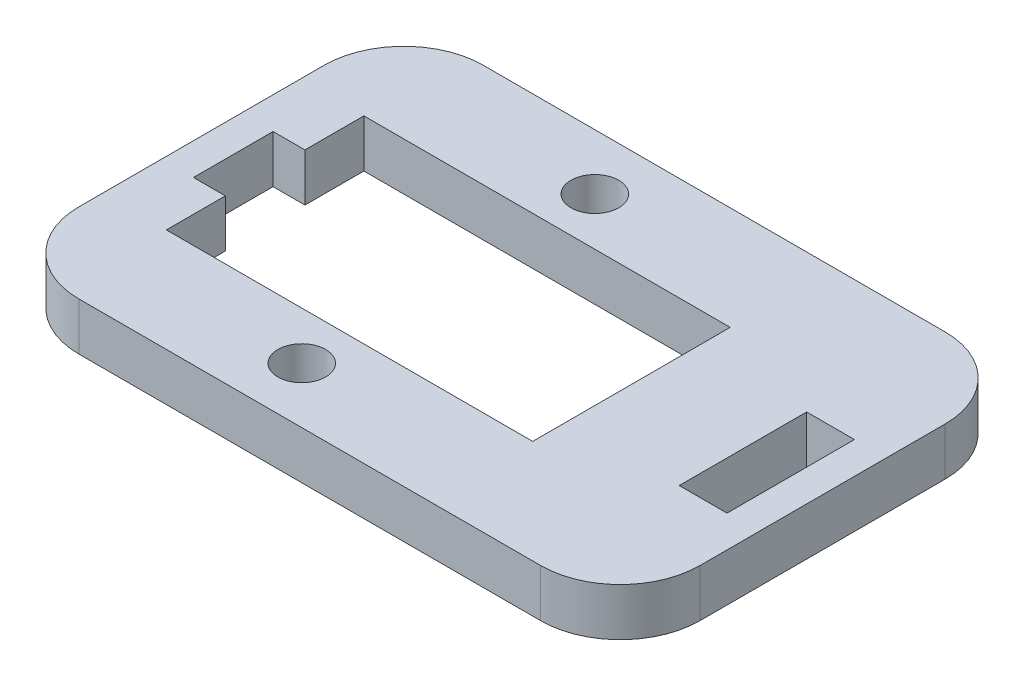
ISO-10303-21;
HEADER;
FILE_DESCRIPTION(('STEP AP214'),'2;1');
FILE_NAME('part.step','',(''),(''),'','','');
FILE_SCHEMA(('AUTOMOTIVE_DESIGN { 1 0 10303 214 1 1 1 1 }'));
ENDSEC;
DATA;
#1=APPLICATION_CONTEXT('core data for automotive mechanical design processes');
#2=APPLICATION_PROTOCOL_DEFINITION('international standard','automotive_design',2000,#1);
#3=PRODUCT_CONTEXT('',#1,'mechanical');
#4=PRODUCT('Part','Part','',(#3));
#5=PRODUCT_RELATED_PRODUCT_CATEGORY('part','',(#4));
#6=PRODUCT_DEFINITION_FORMATION('','',#4);
#7=PRODUCT_DEFINITION_CONTEXT('part definition',#1,'design');
#8=PRODUCT_DEFINITION('design','',#6,#7);
#9=PRODUCT_DEFINITION_SHAPE('','',#8);
#10=(LENGTH_UNIT() NAMED_UNIT(*) SI_UNIT(.MILLI.,.METRE.));
#11=(NAMED_UNIT(*) PLANE_ANGLE_UNIT() SI_UNIT($,.RADIAN.));
#12=(NAMED_UNIT(*) SI_UNIT($,.STERADIAN.) SOLID_ANGLE_UNIT());
#13=UNCERTAINTY_MEASURE_WITH_UNIT(LENGTH_MEASURE(1.E-05),#10,'distance_accuracy_value','');
#14=(GEOMETRIC_REPRESENTATION_CONTEXT(3) GLOBAL_UNCERTAINTY_ASSIGNED_CONTEXT((#13)) GLOBAL_UNIT_ASSIGNED_CONTEXT((#10,
#11,#12)) REPRESENTATION_CONTEXT('',''));
#15=CARTESIAN_POINT('',(0.,0.,0.));
#16=DIRECTION('',(0.,0.,1.));
#17=DIRECTION('',(1.,0.,0.));
#18=AXIS2_PLACEMENT_3D('',#15,#16,#17);
#19=CARTESIAN_POINT('',(1.,3.,-1.5));
#20=DIRECTION('',(0.,-1.,0.));
#21=DIRECTION('',(0.,0.,-1.));
#22=AXIS2_PLACEMENT_3D('',#19,#20,#21);
#23=PLANE('',#22);
#24=CARTESIAN_POINT('',(11.5,3.,-3.));
#25=DIRECTION('',(0.,1.,0.));
#26=DIRECTION('',(0.,0.,1.));
#27=AXIS2_PLACEMENT_3D('',#24,#25,#26);
#28=CIRCLE('',#27,1.5);
#29=CARTESIAN_POINT('',(11.5,3.,-1.5));
#30=VERTEX_POINT('',#29);
#31=EDGE_CURVE('E205',#30,#30,#28,.T.);
#32=ORIENTED_EDGE('',*,*,#31,.F.);
#33=EDGE_LOOP('',(#32));
#34=FACE_BOUND('',#33,.T.);
#35=DIRECTION('',(0.,0.,1.));
#36=VECTOR('',#35,1.);
#37=CARTESIAN_POINT('',(0.,3.,0.));
#38=LINE('',#37,#36);
#39=CARTESIAN_POINT('',(0.,3.,0.));
#40=VERTEX_POINT('',#39);
#41=CARTESIAN_POINT('',(0.,3.,3.7));
#42=VERTEX_POINT('',#41);
#43=EDGE_CURVE('E211',#40,#42,#38,.T.);
#44=ORIENTED_EDGE('',*,*,#43,.F.);
#45=DIRECTION('',(-1.,0.,0.));
#46=VECTOR('',#45,1.);
#47=CARTESIAN_POINT('',(0.,3.,0.));
#48=LINE('',#47,#46);
#49=CARTESIAN_POINT('',(23.,3.,0.));
#50=VERTEX_POINT('',#49);
#51=EDGE_CURVE('E227',#50,#40,#48,.T.);
#52=ORIENTED_EDGE('',*,*,#51,.F.);
#53=DIRECTION('',(0.,0.,-1.));
#54=VECTOR('',#53,1.);
#55=CARTESIAN_POINT('',(23.,3.,0.));
#56=LINE('',#55,#54);
#57=CARTESIAN_POINT('',(23.,3.,12.4));
#58=VERTEX_POINT('',#57);
#59=EDGE_CURVE('E224',#58,#50,#56,.T.);
#60=ORIENTED_EDGE('',*,*,#59,.F.);
#61=DIRECTION('',(1.,0.,0.));
#62=VECTOR('',#61,1.);
#63=CARTESIAN_POINT('',(23.,3.,12.4));
#64=LINE('',#63,#62);
#65=CARTESIAN_POINT('',(0.,3.,12.4));
#66=VERTEX_POINT('',#65);
#67=EDGE_CURVE('E222',#66,#58,#64,.T.);
#68=ORIENTED_EDGE('',*,*,#67,.F.);
#69=DIRECTION('',(0.,0.,1.));
#70=VECTOR('',#69,1.);
#71=CARTESIAN_POINT('',(0.,3.,12.4));
#72=LINE('',#71,#70);
#73=CARTESIAN_POINT('',(0.,3.,8.7));
#74=VERTEX_POINT('',#73);
#75=EDGE_CURVE('E220',#74,#66,#72,.T.);
#76=ORIENTED_EDGE('',*,*,#75,.F.);
#77=DIRECTION('',(1.,0.,0.));
#78=VECTOR('',#77,1.);
#79=CARTESIAN_POINT('',(-2.,3.,8.7));
#80=LINE('',#79,#78);
#81=CARTESIAN_POINT('',(-2.,3.,8.7));
#82=VERTEX_POINT('',#81);
#83=EDGE_CURVE('E218',#82,#74,#80,.T.);
#84=ORIENTED_EDGE('',*,*,#83,.F.);
#85=DIRECTION('',(0.,0.,1.));
#86=VECTOR('',#85,1.);
#87=CARTESIAN_POINT('',(-2.,3.,3.7));
#88=LINE('',#87,#86);
#89=CARTESIAN_POINT('',(-2.,3.,3.7));
#90=VERTEX_POINT('',#89);
#91=EDGE_CURVE('E216',#90,#82,#88,.T.);
#92=ORIENTED_EDGE('',*,*,#91,.F.);
#93=DIRECTION('',(-1.,0.,0.));
#94=VECTOR('',#93,1.);
#95=CARTESIAN_POINT('',(0.,3.,3.7));
#96=LINE('',#95,#94);
#97=EDGE_CURVE('E213',#42,#90,#96,.T.);
#98=ORIENTED_EDGE('',*,*,#97,.F.);
#99=EDGE_LOOP('',(#44,#52,#60,#68,#76,#84,#92,#98));
#100=FACE_BOUND('',#99,.T.);
#101=CARTESIAN_POINT('',(1.,3.,-1.5));
#102=DIRECTION('',(0.,1.,0.));
#103=DIRECTION('',(0.,0.,-1.));
#104=AXIS2_PLACEMENT_3D('',#101,#102,#103);
#105=CIRCLE('',#104,5.);
#106=CARTESIAN_POINT('',(1.00000000000004,3.,-6.5));
#107=VERTEX_POINT('',#106);
#108=CARTESIAN_POINT('',(-4.,3.,-1.49999999999996));
#109=VERTEX_POINT('',#108);
#110=EDGE_CURVE('E270',#107,#109,#105,.T.);
#111=ORIENTED_EDGE('',*,*,#110,.T.);
#112=DIRECTION('',(0.,0.,1.));
#113=VECTOR('',#112,1.);
#114=CARTESIAN_POINT('',(-4.,3.,-1.49999999999996));
#115=LINE('',#114,#113);
#116=CARTESIAN_POINT('',(-4.,3.,13.9));
#117=VERTEX_POINT('',#116);
#118=EDGE_CURVE('E273',#109,#117,#115,.T.);
#119=ORIENTED_EDGE('',*,*,#118,.T.);
#120=CARTESIAN_POINT('',(1.,3.,13.9));
#121=DIRECTION('',(0.,1.,0.));
#122=DIRECTION('',(0.,0.,1.));
#123=AXIS2_PLACEMENT_3D('',#120,#121,#122);
#124=CIRCLE('',#123,5.);
#125=CARTESIAN_POINT('',(1.,3.,18.9));
#126=VERTEX_POINT('',#125);
#127=EDGE_CURVE('E276',#117,#126,#124,.T.);
#128=ORIENTED_EDGE('',*,*,#127,.T.);
#129=DIRECTION('',(1.,0.,0.));
#130=VECTOR('',#129,1.);
#131=CARTESIAN_POINT('',(1.00000000000004,3.,18.9));
#132=LINE('',#131,#130);
#133=CARTESIAN_POINT('',(30.,3.,18.9));
#134=VERTEX_POINT('',#133);
#135=EDGE_CURVE('E278',#126,#134,#132,.T.);
#136=ORIENTED_EDGE('',*,*,#135,.T.);
#137=CARTESIAN_POINT('',(30.,3.,13.9));
#138=DIRECTION('',(0.,1.,0.));
#139=DIRECTION('',(0.,0.,1.));
#140=AXIS2_PLACEMENT_3D('',#137,#138,#139);
#141=CIRCLE('',#140,5.);
#142=CARTESIAN_POINT('',(35.,3.,13.9));
#143=VERTEX_POINT('',#142);
#144=EDGE_CURVE('E280',#134,#143,#141,.T.);
#145=ORIENTED_EDGE('',*,*,#144,.T.);
#146=DIRECTION('',(0.,0.,-1.));
#147=VECTOR('',#146,1.);
#148=CARTESIAN_POINT('',(35.,3.,13.9));
#149=LINE('',#148,#147);
#150=CARTESIAN_POINT('',(35.,3.,-1.49999999999996));
#151=VERTEX_POINT('',#150);
#152=EDGE_CURVE('E282',#143,#151,#149,.T.);
#153=ORIENTED_EDGE('',*,*,#152,.T.);
#154=CARTESIAN_POINT('',(30.,3.,-1.5));
#155=DIRECTION('',(0.,1.,0.));
#156=DIRECTION('',(0.,0.,1.));
#157=AXIS2_PLACEMENT_3D('',#154,#155,#156);
#158=CIRCLE('',#157,5.);
#159=CARTESIAN_POINT('',(30.,3.,-6.5));
#160=VERTEX_POINT('',#159);
#161=EDGE_CURVE('E284',#151,#160,#158,.T.);
#162=ORIENTED_EDGE('',*,*,#161,.T.);
#163=DIRECTION('',(-1.,0.,0.));
#164=VECTOR('',#163,1.);
#165=CARTESIAN_POINT('',(30.,3.,-6.5));
#166=LINE('',#165,#164);
#167=EDGE_CURVE('E286',#160,#107,#166,.T.);
#168=ORIENTED_EDGE('',*,*,#167,.T.);
#169=EDGE_LOOP('',(#111,#119,#128,#136,#145,#153,#162,#168));
#170=FACE_BOUND('',#169,.T.);
#171=DIRECTION('',(1.,0.,0.));
#172=VECTOR('',#171,1.);
#173=CARTESIAN_POINT('',(33.,3.,10.2));
#174=LINE('',#173,#172);
#175=CARTESIAN_POINT('',(30.,3.,10.2));
#176=VERTEX_POINT('',#175);
#177=CARTESIAN_POINT('',(33.,3.,10.2));
#178=VERTEX_POINT('',#177);
#179=EDGE_CURVE('E171',#176,#178,#174,.T.);
#180=ORIENTED_EDGE('',*,*,#179,.F.);
#181=DIRECTION('',(0.,0.,1.));
#182=VECTOR('',#181,1.);
#183=CARTESIAN_POINT('',(30.,3.,10.2));
#184=LINE('',#183,#182);
#185=CARTESIAN_POINT('',(30.,3.,2.2));
#186=VERTEX_POINT('',#185);
#187=EDGE_CURVE('E166',#186,#176,#184,.T.);
#188=ORIENTED_EDGE('',*,*,#187,.F.);
#189=DIRECTION('',(-1.,0.,0.));
#190=VECTOR('',#189,1.);
#191=CARTESIAN_POINT('',(30.,3.,2.2));
#192=LINE('',#191,#190);
#193=CARTESIAN_POINT('',(33.,3.,2.2));
#194=VERTEX_POINT('',#193);
#195=EDGE_CURVE('E187',#194,#186,#192,.T.);
#196=ORIENTED_EDGE('',*,*,#195,.F.);
#197=DIRECTION('',(0.,0.,-1.));
#198=VECTOR('',#197,1.);
#199=CARTESIAN_POINT('',(33.,3.,2.2));
#200=LINE('',#199,#198);
#201=EDGE_CURVE('E185',#178,#194,#200,.T.);
#202=ORIENTED_EDGE('',*,*,#201,.F.);
#203=EDGE_LOOP('',(#180,#188,#196,#202));
#204=FACE_BOUND('',#203,.T.);
#205=CARTESIAN_POINT('',(11.5,3.,15.4));
#206=DIRECTION('',(0.,1.,0.));
#207=DIRECTION('',(0.,0.,-1.));
#208=AXIS2_PLACEMENT_3D('',#205,#206,#207);
#209=CIRCLE('',#208,1.5);
#210=CARTESIAN_POINT('',(11.5,3.,13.9));
#211=VERTEX_POINT('',#210);
#212=EDGE_CURVE('E194',#211,#211,#209,.T.);
#213=ORIENTED_EDGE('',*,*,#212,.F.);
#214=EDGE_LOOP('',(#213));
#215=FACE_BOUND('',#214,.T.);
#216=ADVANCED_FACE('F32',(#34,#100,#170,#204,#215),#23,.F.);
#217=CARTESIAN_POINT('',(1.,0.,-1.5));
#218=DIRECTION('',(0.,-1.,0.));
#219=DIRECTION('',(0.,0.,-1.));
#220=AXIS2_PLACEMENT_3D('',#217,#218,#219);
#221=PLANE('',#220);
#222=DIRECTION('',(0.,0.,1.));
#223=VECTOR('',#222,1.);
#224=CARTESIAN_POINT('',(30.,0.,6.2));
#225=LINE('',#224,#223);
#226=CARTESIAN_POINT('',(30.,0.,2.2));
#227=VERTEX_POINT('',#226);
#228=CARTESIAN_POINT('',(30.,0.,10.2));
#229=VERTEX_POINT('',#228);
#230=EDGE_CURVE('E172',#227,#229,#225,.T.);
#231=ORIENTED_EDGE('',*,*,#230,.T.);
#232=DIRECTION('',(1.,0.,0.));
#233=VECTOR('',#232,1.);
#234=CARTESIAN_POINT('',(33.,0.,10.2));
#235=LINE('',#234,#233);
#236=CARTESIAN_POINT('',(33.,0.,10.2));
#237=VERTEX_POINT('',#236);
#238=EDGE_CURVE('E178',#229,#237,#235,.T.);
#239=ORIENTED_EDGE('',*,*,#238,.T.);
#240=DIRECTION('',(0.,0.,-1.));
#241=VECTOR('',#240,1.);
#242=CARTESIAN_POINT('',(33.,0.,2.2));
#243=LINE('',#242,#241);
#244=CARTESIAN_POINT('',(33.,0.,2.2));
#245=VERTEX_POINT('',#244);
#246=EDGE_CURVE('E193',#237,#245,#243,.T.);
#247=ORIENTED_EDGE('',*,*,#246,.T.);
#248=DIRECTION('',(-1.,0.,0.));
#249=VECTOR('',#248,1.);
#250=CARTESIAN_POINT('',(30.,0.,2.2));
#251=LINE('',#250,#249);
#252=EDGE_CURVE('E197',#245,#227,#251,.T.);
#253=ORIENTED_EDGE('',*,*,#252,.T.);
#254=EDGE_LOOP('',(#231,#239,#247,#253));
#255=FACE_BOUND('',#254,.T.);
#256=CARTESIAN_POINT('',(11.5,0.,-3.));
#257=DIRECTION('',(0.,1.,0.));
#258=DIRECTION('',(0.,0.,1.));
#259=AXIS2_PLACEMENT_3D('',#256,#257,#258);
#260=CIRCLE('',#259,1.5);
#261=CARTESIAN_POINT('',(11.5,0.,-1.5));
#262=VERTEX_POINT('',#261);
#263=EDGE_CURVE('E180',#262,#262,#260,.T.);
#264=ORIENTED_EDGE('',*,*,#263,.T.);
#265=EDGE_LOOP('',(#264));
#266=FACE_BOUND('',#265,.T.);
#267=CARTESIAN_POINT('',(1.,0.,-1.5));
#268=DIRECTION('',(0.,1.,0.));
#269=DIRECTION('',(0.,0.,-1.));
#270=AXIS2_PLACEMENT_3D('',#267,#268,#269);
#271=CIRCLE('',#270,5.);
#272=CARTESIAN_POINT('',(1.00000000000004,0.,-6.5));
#273=VERTEX_POINT('',#272);
#274=CARTESIAN_POINT('',(-4.,0.,-1.49999999999996));
#275=VERTEX_POINT('',#274);
#276=EDGE_CURVE('E269',#273,#275,#271,.T.);
#277=ORIENTED_EDGE('',*,*,#276,.F.);
#278=DIRECTION('',(-1.,0.,0.));
#279=VECTOR('',#278,1.);
#280=CARTESIAN_POINT('',(11.5,0.,-6.5));
#281=LINE('',#280,#279);
#282=CARTESIAN_POINT('',(30.,0.,-6.5));
#283=VERTEX_POINT('',#282);
#284=EDGE_CURVE('E274',#283,#273,#281,.T.);
#285=ORIENTED_EDGE('',*,*,#284,.F.);
#286=CARTESIAN_POINT('',(30.,0.,-1.5));
#287=DIRECTION('',(0.,1.,0.));
#288=DIRECTION('',(0.,0.,1.));
#289=AXIS2_PLACEMENT_3D('',#286,#287,#288);
#290=CIRCLE('',#289,5.);
#291=CARTESIAN_POINT('',(35.,0.,-1.49999999999996));
#292=VERTEX_POINT('',#291);
#293=EDGE_CURVE('E301',#292,#283,#290,.T.);
#294=ORIENTED_EDGE('',*,*,#293,.F.);
#295=DIRECTION('',(0.,0.,-1.));
#296=VECTOR('',#295,1.);
#297=CARTESIAN_POINT('',(35.,0.,13.9));
#298=LINE('',#297,#296);
#299=CARTESIAN_POINT('',(35.,0.,13.9));
#300=VERTEX_POINT('',#299);
#301=EDGE_CURVE('E299',#300,#292,#298,.T.);
#302=ORIENTED_EDGE('',*,*,#301,.F.);
#303=CARTESIAN_POINT('',(30.,0.,13.9));
#304=DIRECTION('',(0.,1.,0.));
#305=DIRECTION('',(0.,0.,1.));
#306=AXIS2_PLACEMENT_3D('',#303,#304,#305);
#307=CIRCLE('',#306,5.);
#308=CARTESIAN_POINT('',(30.,0.,18.9));
#309=VERTEX_POINT('',#308);
#310=EDGE_CURVE('E297',#309,#300,#307,.T.);
#311=ORIENTED_EDGE('',*,*,#310,.F.);
#312=DIRECTION('',(1.,0.,0.));
#313=VECTOR('',#312,1.);
#314=CARTESIAN_POINT('',(1.00000000000004,0.,18.9));
#315=LINE('',#314,#313);
#316=CARTESIAN_POINT('',(1.,0.,18.9));
#317=VERTEX_POINT('',#316);
#318=EDGE_CURVE('E295',#317,#309,#315,.T.);
#319=ORIENTED_EDGE('',*,*,#318,.F.);
#320=CARTESIAN_POINT('',(1.,0.,13.9));
#321=DIRECTION('',(0.,1.,0.));
#322=DIRECTION('',(0.,0.,1.));
#323=AXIS2_PLACEMENT_3D('',#320,#321,#322);
#324=CIRCLE('',#323,5.);
#325=CARTESIAN_POINT('',(-4.,0.,13.9));
#326=VERTEX_POINT('',#325);
#327=EDGE_CURVE('E293',#326,#317,#324,.T.);
#328=ORIENTED_EDGE('',*,*,#327,.F.);
#329=DIRECTION('',(0.,0.,1.));
#330=VECTOR('',#329,1.);
#331=CARTESIAN_POINT('',(-4.,0.,-1.49999999999996));
#332=LINE('',#331,#330);
#333=EDGE_CURVE('E291',#275,#326,#332,.T.);
#334=ORIENTED_EDGE('',*,*,#333,.F.);
#335=EDGE_LOOP('',(#277,#285,#294,#302,#311,#319,#328,#334));
#336=FACE_BOUND('',#335,.T.);
#337=DIRECTION('',(-1.,0.,0.));
#338=VECTOR('',#337,1.);
#339=CARTESIAN_POINT('',(0.,0.,0.));
#340=LINE('',#339,#338);
#341=CARTESIAN_POINT('',(23.,0.,0.));
#342=VERTEX_POINT('',#341);
#343=CARTESIAN_POINT('',(0.,0.,0.));
#344=VERTEX_POINT('',#343);
#345=EDGE_CURVE('E214',#342,#344,#340,.T.);
#346=ORIENTED_EDGE('',*,*,#345,.T.);
#347=DIRECTION('',(0.,0.,1.));
#348=VECTOR('',#347,1.);
#349=CARTESIAN_POINT('',(0.,0.,0.));
#350=LINE('',#349,#348);
#351=CARTESIAN_POINT('',(0.,0.,3.7));
#352=VERTEX_POINT('',#351);
#353=EDGE_CURVE('E208',#344,#352,#350,.T.);
#354=ORIENTED_EDGE('',*,*,#353,.T.);
#355=DIRECTION('',(-1.,0.,0.));
#356=VECTOR('',#355,1.);
#357=CARTESIAN_POINT('',(0.,0.,3.7));
#358=LINE('',#357,#356);
#359=CARTESIAN_POINT('',(-2.,0.,3.7));
#360=VERTEX_POINT('',#359);
#361=EDGE_CURVE('E232',#352,#360,#358,.T.);
#362=ORIENTED_EDGE('',*,*,#361,.T.);
#363=DIRECTION('',(0.,0.,1.));
#364=VECTOR('',#363,1.);
#365=CARTESIAN_POINT('',(-2.,0.,3.7));
#366=LINE('',#365,#364);
#367=CARTESIAN_POINT('',(-2.,0.,8.7));
#368=VERTEX_POINT('',#367);
#369=EDGE_CURVE('E235',#360,#368,#366,.T.);
#370=ORIENTED_EDGE('',*,*,#369,.T.);
#371=DIRECTION('',(1.,0.,0.));
#372=VECTOR('',#371,1.);
#373=CARTESIAN_POINT('',(-2.,0.,8.7));
#374=LINE('',#373,#372);
#375=CARTESIAN_POINT('',(0.,0.,8.7));
#376=VERTEX_POINT('',#375);
#377=EDGE_CURVE('E238',#368,#376,#374,.T.);
#378=ORIENTED_EDGE('',*,*,#377,.T.);
#379=DIRECTION('',(0.,0.,1.));
#380=VECTOR('',#379,1.);
#381=CARTESIAN_POINT('',(0.,0.,12.4));
#382=LINE('',#381,#380);
#383=CARTESIAN_POINT('',(0.,0.,12.4));
#384=VERTEX_POINT('',#383);
#385=EDGE_CURVE('E241',#376,#384,#382,.T.);
#386=ORIENTED_EDGE('',*,*,#385,.T.);
#387=DIRECTION('',(1.,0.,0.));
#388=VECTOR('',#387,1.);
#389=CARTESIAN_POINT('',(23.,0.,12.4));
#390=LINE('',#389,#388);
#391=CARTESIAN_POINT('',(23.,0.,12.4));
#392=VERTEX_POINT('',#391);
#393=EDGE_CURVE('E244',#384,#392,#390,.T.);
#394=ORIENTED_EDGE('',*,*,#393,.T.);
#395=DIRECTION('',(0.,0.,-1.));
#396=VECTOR('',#395,1.);
#397=CARTESIAN_POINT('',(23.,0.,0.));
#398=LINE('',#397,#396);
#399=EDGE_CURVE('E247',#392,#342,#398,.T.);
#400=ORIENTED_EDGE('',*,*,#399,.T.);
#401=EDGE_LOOP('',(#346,#354,#362,#370,#378,#386,#394,#400));
#402=FACE_BOUND('',#401,.T.);
#403=CARTESIAN_POINT('',(11.5,0.,15.4));
#404=DIRECTION('',(0.,1.,0.));
#405=DIRECTION('',(0.,0.,-1.));
#406=AXIS2_PLACEMENT_3D('',#403,#404,#405);
#407=CIRCLE('',#406,1.5);
#408=CARTESIAN_POINT('',(11.5,0.,13.9));
#409=VERTEX_POINT('',#408);
#410=EDGE_CURVE('E436',#409,#409,#407,.T.);
#411=ORIENTED_EDGE('',*,*,#410,.T.);
#412=EDGE_LOOP('',(#411));
#413=FACE_BOUND('',#412,.T.);
#414=ADVANCED_FACE('F332',(#255,#266,#336,#402,#413),#221,.T.);
#415=CARTESIAN_POINT('',(1.,3.,-1.5));
#416=DIRECTION('',(0.,-1.,0.));
#417=DIRECTION('',(0.,0.,-1.));
#418=AXIS2_PLACEMENT_3D('',#415,#416,#417);
#419=CYLINDRICAL_SURFACE('',#418,5.);
#420=ORIENTED_EDGE('',*,*,#276,.T.);
#421=DIRECTION('',(0.,-1.,0.));
#422=VECTOR('',#421,1.);
#423=CARTESIAN_POINT('',(-4.,3.,-1.49999999999996));
#424=LINE('',#423,#422);
#425=EDGE_CURVE('E11',#109,#275,#424,.T.);
#426=ORIENTED_EDGE('',*,*,#425,.F.);
#427=ORIENTED_EDGE('',*,*,#110,.F.);
#428=DIRECTION('',(0.,-1.,0.));
#429=VECTOR('',#428,1.);
#430=CARTESIAN_POINT('',(1.00000000000004,3.,-6.5));
#431=LINE('',#430,#429);
#432=EDGE_CURVE('E288',#107,#273,#431,.T.);
#433=ORIENTED_EDGE('',*,*,#432,.T.);
#434=EDGE_LOOP('',(#420,#426,#427,#433));
#435=FACE_BOUND('',#434,.T.);
#436=ADVANCED_FACE('F34',(#435),#419,.T.);
#437=CARTESIAN_POINT('',(-4.,3.,-1.49999999999996));
#438=DIRECTION('',(1.,0.,0.));
#439=DIRECTION('',(0.,0.,-1.));
#440=AXIS2_PLACEMENT_3D('',#437,#438,#439);
#441=PLANE('',#440);
#442=ORIENTED_EDGE('',*,*,#333,.T.);
#443=DIRECTION('',(0.,-1.,0.));
#444=VECTOR('',#443,1.);
#445=CARTESIAN_POINT('',(-4.,3.,13.9));
#446=LINE('',#445,#444);
#447=EDGE_CURVE('E40',#117,#326,#446,.T.);
#448=ORIENTED_EDGE('',*,*,#447,.F.);
#449=ORIENTED_EDGE('',*,*,#118,.F.);
#450=ORIENTED_EDGE('',*,*,#425,.T.);
#451=EDGE_LOOP('',(#442,#448,#449,#450));
#452=FACE_BOUND('',#451,.T.);
#453=ADVANCED_FACE('F349',(#452),#441,.F.);
#454=CARTESIAN_POINT('',(1.,3.,13.9));
#455=DIRECTION('',(0.,-1.,0.));
#456=DIRECTION('',(0.,0.,-1.));
#457=AXIS2_PLACEMENT_3D('',#454,#455,#456);
#458=CYLINDRICAL_SURFACE('',#457,5.);
#459=ORIENTED_EDGE('',*,*,#327,.T.);
#460=DIRECTION('',(0.,-1.,0.));
#461=VECTOR('',#460,1.);
#462=CARTESIAN_POINT('',(1.,3.,18.9));
#463=LINE('',#462,#461);
#464=EDGE_CURVE('E319',#126,#317,#463,.T.);
#465=ORIENTED_EDGE('',*,*,#464,.F.);
#466=ORIENTED_EDGE('',*,*,#127,.F.);
#467=ORIENTED_EDGE('',*,*,#447,.T.);
#468=EDGE_LOOP('',(#459,#465,#466,#467));
#469=FACE_BOUND('',#468,.T.);
#470=ADVANCED_FACE('F326',(#469),#458,.T.);
#471=CARTESIAN_POINT('',(1.00000000000004,3.,18.9));
#472=DIRECTION('',(0.,0.,-1.));
#473=DIRECTION('',(-1.,0.,0.));
#474=AXIS2_PLACEMENT_3D('',#471,#472,#473);
#475=PLANE('',#474);
#476=ORIENTED_EDGE('',*,*,#318,.T.);
#477=DIRECTION('',(0.,-1.,0.));
#478=VECTOR('',#477,1.);
#479=CARTESIAN_POINT('',(30.,3.,18.9));
#480=LINE('',#479,#478);
#481=EDGE_CURVE('E316',#134,#309,#480,.T.);
#482=ORIENTED_EDGE('',*,*,#481,.F.);
#483=ORIENTED_EDGE('',*,*,#135,.F.);
#484=ORIENTED_EDGE('',*,*,#464,.T.);
#485=EDGE_LOOP('',(#476,#482,#483,#484));
#486=FACE_BOUND('',#485,.T.);
#487=ADVANCED_FACE('F338',(#486),#475,.F.);
#488=CARTESIAN_POINT('',(30.,3.,13.9));
#489=DIRECTION('',(0.,-1.,0.));
#490=DIRECTION('',(0.,0.,-1.));
#491=AXIS2_PLACEMENT_3D('',#488,#489,#490);
#492=CYLINDRICAL_SURFACE('',#491,5.);
#493=ORIENTED_EDGE('',*,*,#310,.T.);
#494=DIRECTION('',(0.,-1.,0.));
#495=VECTOR('',#494,1.);
#496=CARTESIAN_POINT('',(35.,3.,13.9));
#497=LINE('',#496,#495);
#498=EDGE_CURVE('E313',#143,#300,#497,.T.);
#499=ORIENTED_EDGE('',*,*,#498,.F.);
#500=ORIENTED_EDGE('',*,*,#144,.F.);
#501=ORIENTED_EDGE('',*,*,#481,.T.);
#502=EDGE_LOOP('',(#493,#499,#500,#501));
#503=FACE_BOUND('',#502,.T.);
#504=ADVANCED_FACE('F342',(#503),#492,.T.);
#505=CARTESIAN_POINT('',(35.,3.,13.9));
#506=DIRECTION('',(-1.,0.,0.));
#507=DIRECTION('',(0.,0.,1.));
#508=AXIS2_PLACEMENT_3D('',#505,#506,#507);
#509=PLANE('',#508);
#510=ORIENTED_EDGE('',*,*,#301,.T.);
#511=DIRECTION('',(0.,-1.,0.));
#512=VECTOR('',#511,1.);
#513=CARTESIAN_POINT('',(35.,3.,-1.49999999999996));
#514=LINE('',#513,#512);
#515=EDGE_CURVE('E310',#151,#292,#514,.T.);
#516=ORIENTED_EDGE('',*,*,#515,.F.);
#517=ORIENTED_EDGE('',*,*,#152,.F.);
#518=ORIENTED_EDGE('',*,*,#498,.T.);
#519=EDGE_LOOP('',(#510,#516,#517,#518));
#520=FACE_BOUND('',#519,.T.);
#521=ADVANCED_FACE('F370',(#520),#509,.F.);
#522=CARTESIAN_POINT('',(30.,3.,-1.5));
#523=DIRECTION('',(0.,-1.,0.));
#524=DIRECTION('',(0.,0.,-1.));
#525=AXIS2_PLACEMENT_3D('',#522,#523,#524);
#526=CYLINDRICAL_SURFACE('',#525,5.);
#527=ORIENTED_EDGE('',*,*,#293,.T.);
#528=DIRECTION('',(0.,-1.,0.));
#529=VECTOR('',#528,1.);
#530=CARTESIAN_POINT('',(30.,3.,-6.5));
#531=LINE('',#530,#529);
#532=EDGE_CURVE('E307',#160,#283,#531,.T.);
#533=ORIENTED_EDGE('',*,*,#532,.F.);
#534=ORIENTED_EDGE('',*,*,#161,.F.);
#535=ORIENTED_EDGE('',*,*,#515,.T.);
#536=EDGE_LOOP('',(#527,#533,#534,#535));
#537=FACE_BOUND('',#536,.T.);
#538=ADVANCED_FACE('F356',(#537),#526,.T.);
#539=CARTESIAN_POINT('',(11.5,3.,-6.5));
#540=DIRECTION('',(0.,0.,1.));
#541=DIRECTION('',(1.,0.,0.));
#542=AXIS2_PLACEMENT_3D('',#539,#540,#541);
#543=PLANE('',#542);
#544=ORIENTED_EDGE('',*,*,#284,.T.);
#545=ORIENTED_EDGE('',*,*,#432,.F.);
#546=ORIENTED_EDGE('',*,*,#167,.F.);
#547=ORIENTED_EDGE('',*,*,#532,.T.);
#548=EDGE_LOOP('',(#544,#545,#546,#547));
#549=FACE_BOUND('',#548,.T.);
#550=ADVANCED_FACE('F359',(#549),#543,.F.);
#551=CARTESIAN_POINT('',(0.,3.,0.));
#552=DIRECTION('',(1.,0.,0.));
#553=DIRECTION('',(0.,0.,-1.));
#554=AXIS2_PLACEMENT_3D('',#551,#552,#553);
#555=PLANE('',#554);
#556=ORIENTED_EDGE('',*,*,#353,.F.);
#557=DIRECTION('',(0.,-1.,0.));
#558=VECTOR('',#557,1.);
#559=CARTESIAN_POINT('',(0.,3.,0.));
#560=LINE('',#559,#558);
#561=EDGE_CURVE('E229',#40,#344,#560,.T.);
#562=ORIENTED_EDGE('',*,*,#561,.F.);
#563=ORIENTED_EDGE('',*,*,#43,.T.);
#564=DIRECTION('',(0.,-1.,0.));
#565=VECTOR('',#564,1.);
#566=CARTESIAN_POINT('',(0.,3.,3.7));
#567=LINE('',#566,#565);
#568=EDGE_CURVE('E266',#42,#352,#567,.T.);
#569=ORIENTED_EDGE('',*,*,#568,.T.);
#570=EDGE_LOOP('',(#556,#562,#563,#569));
#571=FACE_BOUND('',#570,.T.);
#572=ADVANCED_FACE('F361',(#571),#555,.T.);
#573=CARTESIAN_POINT('',(0.,3.,3.7));
#574=DIRECTION('',(0.,0.,1.));
#575=DIRECTION('',(1.,0.,0.));
#576=AXIS2_PLACEMENT_3D('',#573,#574,#575);
#577=PLANE('',#576);
#578=ORIENTED_EDGE('',*,*,#361,.F.);
#579=ORIENTED_EDGE('',*,*,#568,.F.);
#580=ORIENTED_EDGE('',*,*,#97,.T.);
#581=DIRECTION('',(0.,-1.,0.));
#582=VECTOR('',#581,1.);
#583=CARTESIAN_POINT('',(-2.,3.,3.7));
#584=LINE('',#583,#582);
#585=EDGE_CURVE('E264',#90,#360,#584,.T.);
#586=ORIENTED_EDGE('',*,*,#585,.T.);
#587=EDGE_LOOP('',(#578,#579,#580,#586));
#588=FACE_BOUND('',#587,.T.);
#589=ADVANCED_FACE('F367',(#588),#577,.T.);
#590=CARTESIAN_POINT('',(-2.,3.,3.7));
#591=DIRECTION('',(1.,0.,0.));
#592=DIRECTION('',(0.,0.,-1.));
#593=AXIS2_PLACEMENT_3D('',#590,#591,#592);
#594=PLANE('',#593);
#595=ORIENTED_EDGE('',*,*,#369,.F.);
#596=ORIENTED_EDGE('',*,*,#585,.F.);
#597=ORIENTED_EDGE('',*,*,#91,.T.);
#598=DIRECTION('',(0.,-1.,0.));
#599=VECTOR('',#598,1.);
#600=CARTESIAN_POINT('',(-2.,3.,8.7));
#601=LINE('',#600,#599);
#602=EDGE_CURVE('E262',#82,#368,#601,.T.);
#603=ORIENTED_EDGE('',*,*,#602,.T.);
#604=EDGE_LOOP('',(#595,#596,#597,#603));
#605=FACE_BOUND('',#604,.T.);
#606=ADVANCED_FACE('F385',(#605),#594,.T.);
#607=CARTESIAN_POINT('',(-2.,3.,8.7));
#608=DIRECTION('',(0.,0.,-1.));
#609=DIRECTION('',(-1.,0.,0.));
#610=AXIS2_PLACEMENT_3D('',#607,#608,#609);
#611=PLANE('',#610);
#612=ORIENTED_EDGE('',*,*,#377,.F.);
#613=ORIENTED_EDGE('',*,*,#602,.F.);
#614=ORIENTED_EDGE('',*,*,#83,.T.);
#615=DIRECTION('',(0.,-1.,0.));
#616=VECTOR('',#615,1.);
#617=CARTESIAN_POINT('',(0.,3.,8.7));
#618=LINE('',#617,#616);
#619=EDGE_CURVE('E260',#74,#376,#618,.T.);
#620=ORIENTED_EDGE('',*,*,#619,.T.);
#621=EDGE_LOOP('',(#612,#613,#614,#620));
#622=FACE_BOUND('',#621,.T.);
#623=ADVANCED_FACE('F389',(#622),#611,.T.);
#624=CARTESIAN_POINT('',(0.,3.,12.4));
#625=DIRECTION('',(1.,0.,0.));
#626=DIRECTION('',(0.,0.,-1.));
#627=AXIS2_PLACEMENT_3D('',#624,#625,#626);
#628=PLANE('',#627);
#629=ORIENTED_EDGE('',*,*,#385,.F.);
#630=ORIENTED_EDGE('',*,*,#619,.F.);
#631=ORIENTED_EDGE('',*,*,#75,.T.);
#632=DIRECTION('',(0.,-1.,0.));
#633=VECTOR('',#632,1.);
#634=CARTESIAN_POINT('',(0.,3.,12.4));
#635=LINE('',#634,#633);
#636=EDGE_CURVE('E258',#66,#384,#635,.T.);
#637=ORIENTED_EDGE('',*,*,#636,.T.);
#638=EDGE_LOOP('',(#629,#630,#631,#637));
#639=FACE_BOUND('',#638,.T.);
#640=ADVANCED_FACE('F393',(#639),#628,.T.);
#641=CARTESIAN_POINT('',(23.,3.,12.4));
#642=DIRECTION('',(0.,0.,-1.));
#643=DIRECTION('',(-1.,0.,0.));
#644=AXIS2_PLACEMENT_3D('',#641,#642,#643);
#645=PLANE('',#644);
#646=ORIENTED_EDGE('',*,*,#393,.F.);
#647=ORIENTED_EDGE('',*,*,#636,.F.);
#648=ORIENTED_EDGE('',*,*,#67,.T.);
#649=DIRECTION('',(0.,-1.,0.));
#650=VECTOR('',#649,1.);
#651=CARTESIAN_POINT('',(23.,3.,12.4));
#652=LINE('',#651,#650);
#653=EDGE_CURVE('E256',#58,#392,#652,.T.);
#654=ORIENTED_EDGE('',*,*,#653,.T.);
#655=EDGE_LOOP('',(#646,#647,#648,#654));
#656=FACE_BOUND('',#655,.T.);
#657=ADVANCED_FACE('F397',(#656),#645,.T.);
#658=CARTESIAN_POINT('',(23.,3.,0.));
#659=DIRECTION('',(-1.,0.,0.));
#660=DIRECTION('',(0.,0.,1.));
#661=AXIS2_PLACEMENT_3D('',#658,#659,#660);
#662=PLANE('',#661);
#663=ORIENTED_EDGE('',*,*,#399,.F.);
#664=ORIENTED_EDGE('',*,*,#653,.F.);
#665=ORIENTED_EDGE('',*,*,#59,.T.);
#666=DIRECTION('',(0.,-1.,0.));
#667=VECTOR('',#666,1.);
#668=CARTESIAN_POINT('',(23.,3.,0.));
#669=LINE('',#668,#667);
#670=EDGE_CURVE('E254',#50,#342,#669,.T.);
#671=ORIENTED_EDGE('',*,*,#670,.T.);
#672=EDGE_LOOP('',(#663,#664,#665,#671));
#673=FACE_BOUND('',#672,.T.);
#674=ADVANCED_FACE('F401',(#673),#662,.T.);
#675=CARTESIAN_POINT('',(0.,3.,0.));
#676=DIRECTION('',(0.,0.,1.));
#677=DIRECTION('',(1.,0.,0.));
#678=AXIS2_PLACEMENT_3D('',#675,#676,#677);
#679=PLANE('',#678);
#680=ORIENTED_EDGE('',*,*,#345,.F.);
#681=ORIENTED_EDGE('',*,*,#670,.F.);
#682=ORIENTED_EDGE('',*,*,#51,.T.);
#683=ORIENTED_EDGE('',*,*,#561,.T.);
#684=EDGE_LOOP('',(#680,#681,#682,#683));
#685=FACE_BOUND('',#684,.T.);
#686=ADVANCED_FACE('F405',(#685),#679,.T.);
#687=CARTESIAN_POINT('',(11.5,3.,-3.));
#688=DIRECTION('',(0.,-1.,0.));
#689=DIRECTION('',(0.,0.,-1.));
#690=AXIS2_PLACEMENT_3D('',#687,#688,#689);
#691=CYLINDRICAL_SURFACE('',#690,1.5);
#692=ORIENTED_EDGE('',*,*,#31,.T.);
#693=EDGE_LOOP('',(#692));
#694=FACE_BOUND('',#693,.T.);
#695=ORIENTED_EDGE('',*,*,#263,.F.);
#696=EDGE_LOOP('',(#695));
#697=FACE_BOUND('',#696,.T.);
#698=ADVANCED_FACE('F409',(#694,#697),#691,.F.);
#699=CARTESIAN_POINT('',(33.,3.,10.2));
#700=DIRECTION('',(0.,0.,-1.));
#701=DIRECTION('',(-1.,0.,0.));
#702=AXIS2_PLACEMENT_3D('',#699,#700,#701);
#703=PLANE('',#702);
#704=ORIENTED_EDGE('',*,*,#238,.F.);
#705=DIRECTION('',(0.,-1.,0.));
#706=VECTOR('',#705,1.);
#707=CARTESIAN_POINT('',(30.,3.,10.2));
#708=LINE('',#707,#706);
#709=EDGE_CURVE('E52',#176,#229,#708,.T.);
#710=ORIENTED_EDGE('',*,*,#709,.F.);
#711=ORIENTED_EDGE('',*,*,#179,.T.);
#712=DIRECTION('',(0.,-1.,0.));
#713=VECTOR('',#712,1.);
#714=CARTESIAN_POINT('',(33.,3.,10.2));
#715=LINE('',#714,#713);
#716=EDGE_CURVE('E181',#178,#237,#715,.T.);
#717=ORIENTED_EDGE('',*,*,#716,.T.);
#718=EDGE_LOOP('',(#704,#710,#711,#717));
#719=FACE_BOUND('',#718,.T.);
#720=ADVANCED_FACE('F175',(#719),#703,.T.);
#721=CARTESIAN_POINT('',(33.,3.,2.2));
#722=DIRECTION('',(-1.,0.,0.));
#723=DIRECTION('',(0.,0.,1.));
#724=AXIS2_PLACEMENT_3D('',#721,#722,#723);
#725=PLANE('',#724);
#726=ORIENTED_EDGE('',*,*,#246,.F.);
#727=ORIENTED_EDGE('',*,*,#716,.F.);
#728=ORIENTED_EDGE('',*,*,#201,.T.);
#729=DIRECTION('',(0.,-1.,0.));
#730=VECTOR('',#729,1.);
#731=CARTESIAN_POINT('',(33.,3.,2.2));
#732=LINE('',#731,#730);
#733=EDGE_CURVE('E202',#194,#245,#732,.T.);
#734=ORIENTED_EDGE('',*,*,#733,.T.);
#735=EDGE_LOOP('',(#726,#727,#728,#734));
#736=FACE_BOUND('',#735,.T.);
#737=ADVANCED_FACE('F416',(#736),#725,.T.);
#738=CARTESIAN_POINT('',(30.,3.,2.2));
#739=DIRECTION('',(0.,0.,1.));
#740=DIRECTION('',(1.,0.,0.));
#741=AXIS2_PLACEMENT_3D('',#738,#739,#740);
#742=PLANE('',#741);
#743=ORIENTED_EDGE('',*,*,#252,.F.);
#744=ORIENTED_EDGE('',*,*,#733,.F.);
#745=ORIENTED_EDGE('',*,*,#195,.T.);
#746=DIRECTION('',(0.,-1.,0.));
#747=VECTOR('',#746,1.);
#748=CARTESIAN_POINT('',(30.,3.,2.2));
#749=LINE('',#748,#747);
#750=EDGE_CURVE('E47',#186,#227,#749,.T.);
#751=ORIENTED_EDGE('',*,*,#750,.T.);
#752=EDGE_LOOP('',(#743,#744,#745,#751));
#753=FACE_BOUND('',#752,.T.);
#754=ADVANCED_FACE('F419',(#753),#742,.T.);
#755=CARTESIAN_POINT('',(30.,3.,6.2));
#756=DIRECTION('',(1.,0.,0.));
#757=DIRECTION('',(0.,0.,-1.));
#758=AXIS2_PLACEMENT_3D('',#755,#756,#757);
#759=PLANE('',#758);
#760=ORIENTED_EDGE('',*,*,#230,.F.);
#761=ORIENTED_EDGE('',*,*,#750,.F.);
#762=ORIENTED_EDGE('',*,*,#187,.T.);
#763=ORIENTED_EDGE('',*,*,#709,.T.);
#764=EDGE_LOOP('',(#760,#761,#762,#763));
#765=FACE_BOUND('',#764,.T.);
#766=ADVANCED_FACE('F167',(#765),#759,.T.);
#767=CARTESIAN_POINT('',(11.5,3.,15.4));
#768=DIRECTION('',(0.,-1.,0.));
#769=DIRECTION('',(0.,0.,-1.));
#770=AXIS2_PLACEMENT_3D('',#767,#768,#769);
#771=CYLINDRICAL_SURFACE('',#770,1.5);
#772=ORIENTED_EDGE('',*,*,#212,.T.);
#773=EDGE_LOOP('',(#772));
#774=FACE_BOUND('',#773,.T.);
#775=ORIENTED_EDGE('',*,*,#410,.F.);
#776=EDGE_LOOP('',(#775));
#777=FACE_BOUND('',#776,.T.);
#778=ADVANCED_FACE('F426',(#774,#777),#771,.F.);
#779=CLOSED_SHELL('',(#216,#414,#436,#453,#470,#487,#504,#521,#538,#550,#572,#589,#606,#623,
#640,#657,#674,#686,#698,#720,#737,#754,#766,#778));
#780=MANIFOLD_SOLID_BREP('B2',#779);
#781=ADVANCED_BREP_SHAPE_REPRESENTATION('',(#18,#780),#14);
#782=SHAPE_DEFINITION_REPRESENTATION(#9,#781);
ENDSEC;
END-ISO-10303-21;
